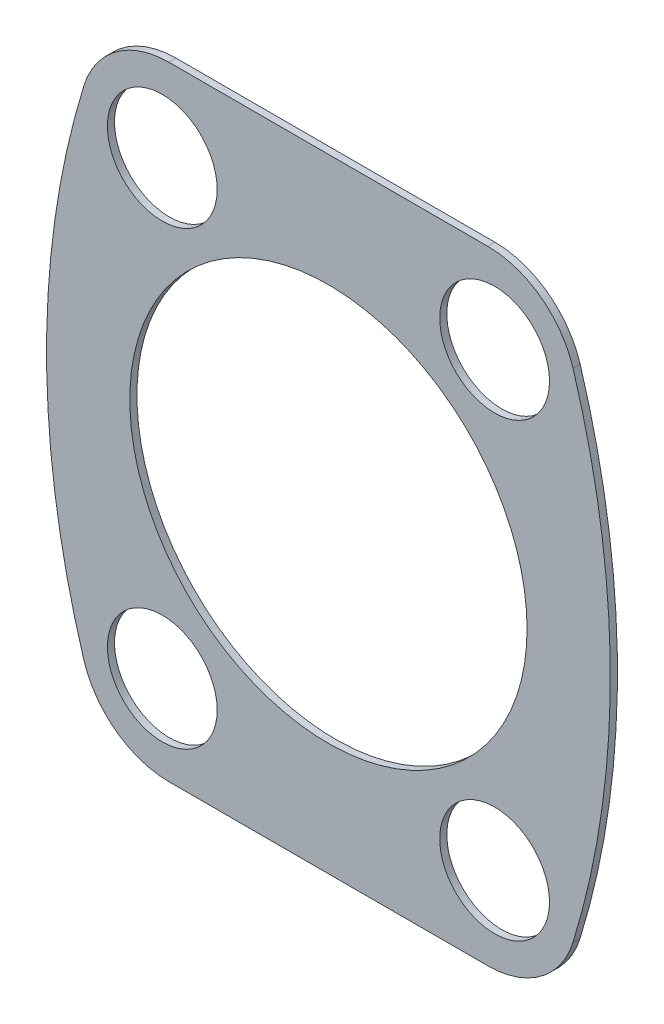
ISO-10303-21;
HEADER;
FILE_DESCRIPTION(('STEP AP214'),'2;1');
FILE_NAME('part.step','',(''),(''),'','','');
FILE_SCHEMA(('AUTOMOTIVE_DESIGN { 1 0 10303 214 1 1 1 1 }'));
ENDSEC;
DATA;
#1=APPLICATION_CONTEXT('core data for automotive mechanical design processes');
#2=APPLICATION_PROTOCOL_DEFINITION('international standard','automotive_design',2000,#1);
#3=PRODUCT_CONTEXT('',#1,'mechanical');
#4=PRODUCT('Part','Part','',(#3));
#5=PRODUCT_RELATED_PRODUCT_CATEGORY('part','',(#4));
#6=PRODUCT_DEFINITION_FORMATION('','',#4);
#7=PRODUCT_DEFINITION_CONTEXT('part definition',#1,'design');
#8=PRODUCT_DEFINITION('design','',#6,#7);
#9=PRODUCT_DEFINITION_SHAPE('','',#8);
#10=(LENGTH_UNIT() NAMED_UNIT(*) SI_UNIT(.MILLI.,.METRE.));
#11=(NAMED_UNIT(*) PLANE_ANGLE_UNIT() SI_UNIT($,.RADIAN.));
#12=(NAMED_UNIT(*) SI_UNIT($,.STERADIAN.) SOLID_ANGLE_UNIT());
#13=UNCERTAINTY_MEASURE_WITH_UNIT(LENGTH_MEASURE(1.E-05),#10,'distance_accuracy_value','');
#14=(GEOMETRIC_REPRESENTATION_CONTEXT(3) GLOBAL_UNCERTAINTY_ASSIGNED_CONTEXT((#13)) GLOBAL_UNIT_ASSIGNED_CONTEXT((#10,
#11,#12)) REPRESENTATION_CONTEXT('',''));
#15=CARTESIAN_POINT('',(0.,0.,0.));
#16=DIRECTION('',(0.,0.,1.));
#17=DIRECTION('',(1.,0.,0.));
#18=AXIS2_PLACEMENT_3D('',#15,#16,#17);
#19=CARTESIAN_POINT('',(-26.875,37.5000000000001,1.19999999999998));
#20=DIRECTION('',(0.,0.,1.));
#21=DIRECTION('',(1.,0.,0.));
#22=AXIS2_PLACEMENT_3D('',#19,#20,#21);
#23=PLANE('',#22);
#24=CARTESIAN_POINT('',(-28.,38.,1.19999999999998));
#25=DIRECTION('',(0.,0.,1.));
#26=DIRECTION('',(1.,0.,0.));
#27=AXIS2_PLACEMENT_3D('',#24,#25,#26);
#28=CIRCLE('',#27,9.25);
#29=CARTESIAN_POINT('',(-18.75,38.,1.19999999999998));
#30=VERTEX_POINT('',#29);
#31=EDGE_CURVE('E204',#30,#30,#28,.T.);
#32=ORIENTED_EDGE('',*,*,#31,.F.);
#33=EDGE_LOOP('',(#32));
#34=FACE_BOUND('',#33,.T.);
#35=CARTESIAN_POINT('',(28.,-38.,1.19999999999998));
#36=DIRECTION('',(0.,0.,1.));
#37=DIRECTION('',(1.,0.,0.));
#38=AXIS2_PLACEMENT_3D('',#35,#36,#37);
#39=CIRCLE('',#38,9.25);
#40=CARTESIAN_POINT('',(37.25,-38.,1.19999999999998));
#41=VERTEX_POINT('',#40);
#42=EDGE_CURVE('E192',#41,#41,#39,.T.);
#43=ORIENTED_EDGE('',*,*,#42,.F.);
#44=EDGE_LOOP('',(#43));
#45=FACE_BOUND('',#44,.T.);
#46=CARTESIAN_POINT('',(-26.875,37.5000000000001,1.19999999999998));
#47=DIRECTION('',(0.,0.,1.));
#48=DIRECTION('',(1.,0.,0.));
#49=AXIS2_PLACEMENT_3D('',#46,#47,#48);
#50=CIRCLE('',#49,15.);
#51=CARTESIAN_POINT('',(-26.875,52.5,1.19999999999998));
#52=VERTEX_POINT('',#51);
#53=CARTESIAN_POINT('',(-41.2148533007335,41.9009779951101,1.19999999999998));
#54=VERTEX_POINT('',#53);
#55=EDGE_CURVE('E155',#52,#54,#50,.T.);
#56=ORIENTED_EDGE('',*,*,#55,.T.);
#57=CARTESIAN_POINT('',(95.3124999999993,0.,1.19999999999998));
#58=DIRECTION('',(0.,0.,1.));
#59=DIRECTION('',(1.,0.,0.));
#60=AXIS2_PLACEMENT_3D('',#57,#58,#59);
#61=CIRCLE('',#60,142.812499999999);
#62=CARTESIAN_POINT('',(-41.2148533007335,-41.9009779951098,1.19999999999998));
#63=VERTEX_POINT('',#62);
#64=EDGE_CURVE('E103',#54,#63,#61,.T.);
#65=ORIENTED_EDGE('',*,*,#64,.T.);
#66=CARTESIAN_POINT('',(-26.875,-37.5000000000001,1.19999999999998));
#67=DIRECTION('',(0.,0.,1.));
#68=DIRECTION('',(1.,0.,0.));
#69=AXIS2_PLACEMENT_3D('',#66,#67,#68);
#70=CIRCLE('',#69,15.);
#71=CARTESIAN_POINT('',(-26.875,-52.5,1.19999999999998));
#72=VERTEX_POINT('',#71);
#73=EDGE_CURVE('E170',#63,#72,#70,.T.);
#74=ORIENTED_EDGE('',*,*,#73,.T.);
#75=DIRECTION('',(1.,0.,0.));
#76=VECTOR('',#75,1.);
#77=CARTESIAN_POINT('',(-26.875,-52.5,1.19999999999998));
#78=LINE('',#77,#76);
#79=CARTESIAN_POINT('',(26.875,-52.5,1.19999999999998));
#80=VERTEX_POINT('',#79);
#81=EDGE_CURVE('E183',#72,#80,#78,.T.);
#82=ORIENTED_EDGE('',*,*,#81,.T.);
#83=CARTESIAN_POINT('',(26.875,-37.5000000000001,1.19999999999998));
#84=DIRECTION('',(0.,0.,1.));
#85=DIRECTION('',(1.,0.,0.));
#86=AXIS2_PLACEMENT_3D('',#83,#84,#85);
#87=CIRCLE('',#86,15.);
#88=CARTESIAN_POINT('',(41.2148533007335,-41.9009779951101,1.19999999999998));
#89=VERTEX_POINT('',#88);
#90=EDGE_CURVE('E122',#80,#89,#87,.T.);
#91=ORIENTED_EDGE('',*,*,#90,.T.);
#92=CARTESIAN_POINT('',(-95.3124999999993,0.,1.19999999999998));
#93=DIRECTION('',(0.,0.,1.));
#94=DIRECTION('',(1.,0.,0.));
#95=AXIS2_PLACEMENT_3D('',#92,#93,#94);
#96=CIRCLE('',#95,142.812499999999);
#97=CARTESIAN_POINT('',(41.2148533007335,41.9009779951101,1.19999999999998));
#98=VERTEX_POINT('',#97);
#99=EDGE_CURVE('E116',#89,#98,#96,.T.);
#100=ORIENTED_EDGE('',*,*,#99,.T.);
#101=CARTESIAN_POINT('',(26.875,37.5000000000001,1.19999999999998));
#102=DIRECTION('',(0.,0.,1.));
#103=DIRECTION('',(1.,0.,0.));
#104=AXIS2_PLACEMENT_3D('',#101,#102,#103);
#105=CIRCLE('',#104,15.);
#106=CARTESIAN_POINT('',(26.875,52.5,1.19999999999998));
#107=VERTEX_POINT('',#106);
#108=EDGE_CURVE('E120',#98,#107,#105,.T.);
#109=ORIENTED_EDGE('',*,*,#108,.T.);
#110=DIRECTION('',(-1.,0.,0.));
#111=VECTOR('',#110,1.);
#112=CARTESIAN_POINT('',(26.875,52.5,1.19999999999998));
#113=LINE('',#112,#111);
#114=EDGE_CURVE('E60',#107,#52,#113,.T.);
#115=ORIENTED_EDGE('',*,*,#114,.T.);
#116=EDGE_LOOP('',(#56,#65,#74,#82,#91,#100,#109,#115));
#117=FACE_BOUND('',#116,.T.);
#118=CARTESIAN_POINT('',(-28.,-38.,1.19999999999998));
#119=DIRECTION('',(0.,0.,1.));
#120=DIRECTION('',(1.,0.,0.));
#121=AXIS2_PLACEMENT_3D('',#118,#119,#120);
#122=CIRCLE('',#121,9.25);
#123=CARTESIAN_POINT('',(-18.75,-38.,1.19999999999998));
#124=VERTEX_POINT('',#123);
#125=EDGE_CURVE('E144',#124,#124,#122,.T.);
#126=ORIENTED_EDGE('',*,*,#125,.F.);
#127=EDGE_LOOP('',(#126));
#128=FACE_BOUND('',#127,.T.);
#129=CARTESIAN_POINT('',(28.,38.,1.19999999999998));
#130=DIRECTION('',(0.,0.,1.));
#131=DIRECTION('',(1.,0.,0.));
#132=AXIS2_PLACEMENT_3D('',#129,#130,#131);
#133=CIRCLE('',#132,9.25);
#134=CARTESIAN_POINT('',(37.25,38.,1.19999999999998));
#135=VERTEX_POINT('',#134);
#136=EDGE_CURVE('E198',#135,#135,#133,.T.);
#137=ORIENTED_EDGE('',*,*,#136,.F.);
#138=EDGE_LOOP('',(#137));
#139=FACE_BOUND('',#138,.T.);
#140=CARTESIAN_POINT('',(0.,0.,1.19999999999998));
#141=DIRECTION('',(0.,0.,1.));
#142=DIRECTION('',(1.,0.,0.));
#143=AXIS2_PLACEMENT_3D('',#140,#141,#142);
#144=CIRCLE('',#143,33.475);
#145=CARTESIAN_POINT('',(33.475,0.,1.19999999999998));
#146=VERTEX_POINT('',#145);
#147=EDGE_CURVE('E210',#146,#146,#144,.T.);
#148=ORIENTED_EDGE('',*,*,#147,.F.);
#149=EDGE_LOOP('',(#148));
#150=FACE_BOUND('',#149,.T.);
#151=ADVANCED_FACE('F43',(#34,#45,#117,#128,#139,#150),#23,.T.);
#152=CARTESIAN_POINT('',(-26.875,37.5000000000001,0.));
#153=DIRECTION('',(0.,0.,1.));
#154=DIRECTION('',(1.,0.,0.));
#155=AXIS2_PLACEMENT_3D('',#152,#153,#154);
#156=PLANE('',#155);
#157=CARTESIAN_POINT('',(-28.,38.,0.));
#158=DIRECTION('',(0.,0.,1.));
#159=DIRECTION('',(1.,0.,0.));
#160=AXIS2_PLACEMENT_3D('',#157,#158,#159);
#161=CIRCLE('',#160,9.25);
#162=CARTESIAN_POINT('',(-18.75,38.,0.));
#163=VERTEX_POINT('',#162);
#164=EDGE_CURVE('E207',#163,#163,#161,.T.);
#165=ORIENTED_EDGE('',*,*,#164,.T.);
#166=EDGE_LOOP('',(#165));
#167=FACE_BOUND('',#166,.T.);
#168=CARTESIAN_POINT('',(28.,-38.,0.));
#169=DIRECTION('',(0.,0.,1.));
#170=DIRECTION('',(1.,0.,0.));
#171=AXIS2_PLACEMENT_3D('',#168,#169,#170);
#172=CIRCLE('',#171,9.25);
#173=CARTESIAN_POINT('',(37.25,-38.,0.));
#174=VERTEX_POINT('',#173);
#175=EDGE_CURVE('E195',#174,#174,#172,.T.);
#176=ORIENTED_EDGE('',*,*,#175,.T.);
#177=EDGE_LOOP('',(#176));
#178=FACE_BOUND('',#177,.T.);
#179=CARTESIAN_POINT('',(-26.875,37.5000000000001,0.));
#180=DIRECTION('',(0.,0.,1.));
#181=DIRECTION('',(1.,0.,0.));
#182=AXIS2_PLACEMENT_3D('',#179,#180,#181);
#183=CIRCLE('',#182,15.);
#184=CARTESIAN_POINT('',(-26.875,52.5,0.));
#185=VERTEX_POINT('',#184);
#186=CARTESIAN_POINT('',(-41.2148533007335,41.9009779951101,0.));
#187=VERTEX_POINT('',#186);
#188=EDGE_CURVE('E140',#185,#187,#183,.T.);
#189=ORIENTED_EDGE('',*,*,#188,.F.);
#190=DIRECTION('',(-1.,0.,0.));
#191=VECTOR('',#190,1.);
#192=CARTESIAN_POINT('',(26.875,52.5,0.));
#193=LINE('',#192,#191);
#194=CARTESIAN_POINT('',(26.875,52.5,0.));
#195=VERTEX_POINT('',#194);
#196=EDGE_CURVE('E95',#195,#185,#193,.T.);
#197=ORIENTED_EDGE('',*,*,#196,.F.);
#198=CARTESIAN_POINT('',(26.875,37.5000000000001,0.));
#199=DIRECTION('',(0.,0.,1.));
#200=DIRECTION('',(1.,0.,0.));
#201=AXIS2_PLACEMENT_3D('',#198,#199,#200);
#202=CIRCLE('',#201,15.);
#203=CARTESIAN_POINT('',(41.2148533007335,41.9009779951101,0.));
#204=VERTEX_POINT('',#203);
#205=EDGE_CURVE('E89',#204,#195,#202,.T.);
#206=ORIENTED_EDGE('',*,*,#205,.F.);
#207=CARTESIAN_POINT('',(-95.3124999999993,0.,0.));
#208=DIRECTION('',(0.,0.,1.));
#209=DIRECTION('',(1.,0.,0.));
#210=AXIS2_PLACEMENT_3D('',#207,#208,#209);
#211=CIRCLE('',#210,142.812499999999);
#212=CARTESIAN_POINT('',(41.2148533007335,-41.9009779951101,0.));
#213=VERTEX_POINT('',#212);
#214=EDGE_CURVE('E130',#213,#204,#211,.T.);
#215=ORIENTED_EDGE('',*,*,#214,.F.);
#216=CARTESIAN_POINT('',(26.875,-37.5000000000001,0.));
#217=DIRECTION('',(0.,0.,1.));
#218=DIRECTION('',(1.,0.,0.));
#219=AXIS2_PLACEMENT_3D('',#216,#217,#218);
#220=CIRCLE('',#219,15.);
#221=CARTESIAN_POINT('',(26.875,-52.5,0.));
#222=VERTEX_POINT('',#221);
#223=EDGE_CURVE('E150',#222,#213,#220,.T.);
#224=ORIENTED_EDGE('',*,*,#223,.F.);
#225=DIRECTION('',(1.,0.,0.));
#226=VECTOR('',#225,1.);
#227=CARTESIAN_POINT('',(-26.875,-52.5,0.));
#228=LINE('',#227,#226);
#229=CARTESIAN_POINT('',(-26.875,-52.5,0.));
#230=VERTEX_POINT('',#229);
#231=EDGE_CURVE('E148',#230,#222,#228,.T.);
#232=ORIENTED_EDGE('',*,*,#231,.F.);
#233=CARTESIAN_POINT('',(-26.875,-37.5000000000001,0.));
#234=DIRECTION('',(0.,0.,1.));
#235=DIRECTION('',(1.,0.,0.));
#236=AXIS2_PLACEMENT_3D('',#233,#234,#235);
#237=CIRCLE('',#236,15.);
#238=CARTESIAN_POINT('',(-41.2148533007335,-41.9009779951098,0.));
#239=VERTEX_POINT('',#238);
#240=EDGE_CURVE('E146',#239,#230,#237,.T.);
#241=ORIENTED_EDGE('',*,*,#240,.F.);
#242=CARTESIAN_POINT('',(95.3124999999993,0.,0.));
#243=DIRECTION('',(0.,0.,1.));
#244=DIRECTION('',(1.,0.,0.));
#245=AXIS2_PLACEMENT_3D('',#242,#243,#244);
#246=CIRCLE('',#245,142.812499999999);
#247=EDGE_CURVE('E143',#187,#239,#246,.T.);
#248=ORIENTED_EDGE('',*,*,#247,.F.);
#249=EDGE_LOOP('',(#189,#197,#206,#215,#224,#232,#241,#248));
#250=FACE_BOUND('',#249,.T.);
#251=CARTESIAN_POINT('',(-28.,-38.,0.));
#252=DIRECTION('',(0.,0.,1.));
#253=DIRECTION('',(1.,0.,0.));
#254=AXIS2_PLACEMENT_3D('',#251,#252,#253);
#255=CIRCLE('',#254,9.25);
#256=CARTESIAN_POINT('',(-18.75,-38.,0.));
#257=VERTEX_POINT('',#256);
#258=EDGE_CURVE('E189',#257,#257,#255,.T.);
#259=ORIENTED_EDGE('',*,*,#258,.T.);
#260=EDGE_LOOP('',(#259));
#261=FACE_BOUND('',#260,.T.);
#262=CARTESIAN_POINT('',(28.,38.,0.));
#263=DIRECTION('',(0.,0.,1.));
#264=DIRECTION('',(1.,0.,0.));
#265=AXIS2_PLACEMENT_3D('',#262,#263,#264);
#266=CIRCLE('',#265,9.25);
#267=CARTESIAN_POINT('',(37.25,38.,0.));
#268=VERTEX_POINT('',#267);
#269=EDGE_CURVE('E201',#268,#268,#266,.T.);
#270=ORIENTED_EDGE('',*,*,#269,.T.);
#271=EDGE_LOOP('',(#270));
#272=FACE_BOUND('',#271,.T.);
#273=CARTESIAN_POINT('',(0.,0.,0.));
#274=DIRECTION('',(0.,0.,1.));
#275=DIRECTION('',(1.,0.,0.));
#276=AXIS2_PLACEMENT_3D('',#273,#274,#275);
#277=CIRCLE('',#276,33.475);
#278=CARTESIAN_POINT('',(33.475,0.,0.));
#279=VERTEX_POINT('',#278);
#280=EDGE_CURVE('E213',#279,#279,#277,.T.);
#281=ORIENTED_EDGE('',*,*,#280,.T.);
#282=EDGE_LOOP('',(#281));
#283=FACE_BOUND('',#282,.T.);
#284=ADVANCED_FACE('F174',(#167,#178,#250,#261,#272,#283),#156,.F.);
#285=CARTESIAN_POINT('',(-26.875,37.5000000000001,1.19999999999998));
#286=DIRECTION('',(0.,0.,-1.));
#287=DIRECTION('',(-1.,0.,0.));
#288=AXIS2_PLACEMENT_3D('',#285,#286,#287);
#289=CYLINDRICAL_SURFACE('',#288,15.);
#290=ORIENTED_EDGE('',*,*,#188,.T.);
#291=DIRECTION('',(0.,0.,-1.));
#292=VECTOR('',#291,1.);
#293=CARTESIAN_POINT('',(-41.2148533007335,41.9009779951101,1.19999999999998));
#294=LINE('',#293,#292);
#295=EDGE_CURVE('E11',#54,#187,#294,.T.);
#296=ORIENTED_EDGE('',*,*,#295,.F.);
#297=ORIENTED_EDGE('',*,*,#55,.F.);
#298=DIRECTION('',(0.,0.,-1.));
#299=VECTOR('',#298,1.);
#300=CARTESIAN_POINT('',(-26.875,52.5,1.19999999999998));
#301=LINE('',#300,#299);
#302=EDGE_CURVE('E136',#52,#185,#301,.T.);
#303=ORIENTED_EDGE('',*,*,#302,.T.);
#304=EDGE_LOOP('',(#290,#296,#297,#303));
#305=FACE_BOUND('',#304,.T.);
#306=ADVANCED_FACE('F45',(#305),#289,.T.);
#307=CARTESIAN_POINT('',(95.3124999999993,0.,1.19999999999998));
#308=DIRECTION('',(0.,0.,-1.));
#309=DIRECTION('',(-1.,0.,0.));
#310=AXIS2_PLACEMENT_3D('',#307,#308,#309);
#311=CYLINDRICAL_SURFACE('',#310,142.812499999999);
#312=ORIENTED_EDGE('',*,*,#247,.T.);
#313=DIRECTION('',(0.,0.,-1.));
#314=VECTOR('',#313,1.);
#315=CARTESIAN_POINT('',(-41.2148533007335,-41.9009779951098,1.19999999999998));
#316=LINE('',#315,#314);
#317=EDGE_CURVE('E52',#63,#239,#316,.T.);
#318=ORIENTED_EDGE('',*,*,#317,.F.);
#319=ORIENTED_EDGE('',*,*,#64,.F.);
#320=ORIENTED_EDGE('',*,*,#295,.T.);
#321=EDGE_LOOP('',(#312,#318,#319,#320));
#322=FACE_BOUND('',#321,.T.);
#323=ADVANCED_FACE('F248',(#322),#311,.T.);
#324=CARTESIAN_POINT('',(-26.875,-37.5000000000001,1.19999999999998));
#325=DIRECTION('',(0.,0.,-1.));
#326=DIRECTION('',(-1.,0.,0.));
#327=AXIS2_PLACEMENT_3D('',#324,#325,#326);
#328=CYLINDRICAL_SURFACE('',#327,15.);
#329=ORIENTED_EDGE('',*,*,#240,.T.);
#330=DIRECTION('',(0.,0.,-1.));
#331=VECTOR('',#330,1.);
#332=CARTESIAN_POINT('',(-26.875,-52.5,1.19999999999998));
#333=LINE('',#332,#331);
#334=EDGE_CURVE('E162',#72,#230,#333,.T.);
#335=ORIENTED_EDGE('',*,*,#334,.F.);
#336=ORIENTED_EDGE('',*,*,#73,.F.);
#337=ORIENTED_EDGE('',*,*,#317,.T.);
#338=EDGE_LOOP('',(#329,#335,#336,#337));
#339=FACE_BOUND('',#338,.T.);
#340=ADVANCED_FACE('F168',(#339),#328,.T.);
#341=CARTESIAN_POINT('',(-26.875,-52.5,1.19999999999998));
#342=DIRECTION('',(0.,1.,0.));
#343=DIRECTION('',(-1.,0.,0.));
#344=AXIS2_PLACEMENT_3D('',#341,#342,#343);
#345=PLANE('',#344);
#346=ORIENTED_EDGE('',*,*,#231,.T.);
#347=DIRECTION('',(0.,0.,-1.));
#348=VECTOR('',#347,1.);
#349=CARTESIAN_POINT('',(26.875,-52.5,1.19999999999998));
#350=LINE('',#349,#348);
#351=EDGE_CURVE('E159',#80,#222,#350,.T.);
#352=ORIENTED_EDGE('',*,*,#351,.F.);
#353=ORIENTED_EDGE('',*,*,#81,.F.);
#354=ORIENTED_EDGE('',*,*,#334,.T.);
#355=EDGE_LOOP('',(#346,#352,#353,#354));
#356=FACE_BOUND('',#355,.T.);
#357=ADVANCED_FACE('F179',(#356),#345,.F.);
#358=CARTESIAN_POINT('',(26.875,-37.5000000000001,1.19999999999998));
#359=DIRECTION('',(0.,0.,-1.));
#360=DIRECTION('',(-1.,0.,0.));
#361=AXIS2_PLACEMENT_3D('',#358,#359,#360);
#362=CYLINDRICAL_SURFACE('',#361,15.);
#363=ORIENTED_EDGE('',*,*,#223,.T.);
#364=DIRECTION('',(0.,0.,-1.));
#365=VECTOR('',#364,1.);
#366=CARTESIAN_POINT('',(41.2148533007335,-41.9009779951101,1.19999999999998));
#367=LINE('',#366,#365);
#368=EDGE_CURVE('E131',#89,#213,#367,.T.);
#369=ORIENTED_EDGE('',*,*,#368,.F.);
#370=ORIENTED_EDGE('',*,*,#90,.F.);
#371=ORIENTED_EDGE('',*,*,#351,.T.);
#372=EDGE_LOOP('',(#363,#369,#370,#371));
#373=FACE_BOUND('',#372,.T.);
#374=ADVANCED_FACE('F182',(#373),#362,.T.);
#375=CARTESIAN_POINT('',(-95.3124999999993,0.,1.19999999999998));
#376=DIRECTION('',(0.,0.,-1.));
#377=DIRECTION('',(-1.,0.,0.));
#378=AXIS2_PLACEMENT_3D('',#375,#376,#377);
#379=CYLINDRICAL_SURFACE('',#378,142.812499999999);
#380=ORIENTED_EDGE('',*,*,#214,.T.);
#381=DIRECTION('',(0.,0.,-1.));
#382=VECTOR('',#381,1.);
#383=CARTESIAN_POINT('',(41.2148533007335,41.9009779951101,1.19999999999998));
#384=LINE('',#383,#382);
#385=EDGE_CURVE('E127',#98,#204,#384,.T.);
#386=ORIENTED_EDGE('',*,*,#385,.F.);
#387=ORIENTED_EDGE('',*,*,#99,.F.);
#388=ORIENTED_EDGE('',*,*,#368,.T.);
#389=EDGE_LOOP('',(#380,#386,#387,#388));
#390=FACE_BOUND('',#389,.T.);
#391=ADVANCED_FACE('F128',(#390),#379,.T.);
#392=CARTESIAN_POINT('',(26.875,37.5000000000001,1.19999999999998));
#393=DIRECTION('',(0.,0.,-1.));
#394=DIRECTION('',(-1.,0.,0.));
#395=AXIS2_PLACEMENT_3D('',#392,#393,#394);
#396=CYLINDRICAL_SURFACE('',#395,15.);
#397=ORIENTED_EDGE('',*,*,#205,.T.);
#398=DIRECTION('',(0.,0.,-1.));
#399=VECTOR('',#398,1.);
#400=CARTESIAN_POINT('',(26.875,52.5,1.19999999999998));
#401=LINE('',#400,#399);
#402=EDGE_CURVE('E132',#107,#195,#401,.T.);
#403=ORIENTED_EDGE('',*,*,#402,.F.);
#404=ORIENTED_EDGE('',*,*,#108,.F.);
#405=ORIENTED_EDGE('',*,*,#385,.T.);
#406=EDGE_LOOP('',(#397,#403,#404,#405));
#407=FACE_BOUND('',#406,.T.);
#408=ADVANCED_FACE('F134',(#407),#396,.T.);
#409=CARTESIAN_POINT('',(26.875,52.5,1.19999999999998));
#410=DIRECTION('',(0.,-1.,0.));
#411=DIRECTION('',(0.,0.,-1.));
#412=AXIS2_PLACEMENT_3D('',#409,#410,#411);
#413=PLANE('',#412);
#414=ORIENTED_EDGE('',*,*,#196,.T.);
#415=ORIENTED_EDGE('',*,*,#302,.F.);
#416=ORIENTED_EDGE('',*,*,#114,.F.);
#417=ORIENTED_EDGE('',*,*,#402,.T.);
#418=EDGE_LOOP('',(#414,#415,#416,#417));
#419=FACE_BOUND('',#418,.T.);
#420=ADVANCED_FACE('F236',(#419),#413,.F.);
#421=CARTESIAN_POINT('',(-28.,-38.,1.19999999999998));
#422=DIRECTION('',(0.,0.,-1.));
#423=DIRECTION('',(-1.,0.,0.));
#424=AXIS2_PLACEMENT_3D('',#421,#422,#423);
#425=CYLINDRICAL_SURFACE('',#424,9.25);
#426=ORIENTED_EDGE('',*,*,#125,.T.);
#427=EDGE_LOOP('',(#426));
#428=FACE_BOUND('',#427,.T.);
#429=ORIENTED_EDGE('',*,*,#258,.F.);
#430=EDGE_LOOP('',(#429));
#431=FACE_BOUND('',#430,.T.);
#432=ADVANCED_FACE('F233',(#428,#431),#425,.F.);
#433=CARTESIAN_POINT('',(28.,-38.,1.19999999999998));
#434=DIRECTION('',(0.,0.,-1.));
#435=DIRECTION('',(-1.,0.,0.));
#436=AXIS2_PLACEMENT_3D('',#433,#434,#435);
#437=CYLINDRICAL_SURFACE('',#436,9.25);
#438=ORIENTED_EDGE('',*,*,#42,.T.);
#439=EDGE_LOOP('',(#438));
#440=FACE_BOUND('',#439,.T.);
#441=ORIENTED_EDGE('',*,*,#175,.F.);
#442=EDGE_LOOP('',(#441));
#443=FACE_BOUND('',#442,.T.);
#444=ADVANCED_FACE('F297',(#440,#443),#437,.F.);
#445=CARTESIAN_POINT('',(28.,38.,1.19999999999998));
#446=DIRECTION('',(0.,0.,-1.));
#447=DIRECTION('',(-1.,0.,0.));
#448=AXIS2_PLACEMENT_3D('',#445,#446,#447);
#449=CYLINDRICAL_SURFACE('',#448,9.25);
#450=ORIENTED_EDGE('',*,*,#136,.T.);
#451=EDGE_LOOP('',(#450));
#452=FACE_BOUND('',#451,.T.);
#453=ORIENTED_EDGE('',*,*,#269,.F.);
#454=EDGE_LOOP('',(#453));
#455=FACE_BOUND('',#454,.T.);
#456=ADVANCED_FACE('F304',(#452,#455),#449,.F.);
#457=CARTESIAN_POINT('',(-28.,38.,1.19999999999998));
#458=DIRECTION('',(0.,0.,-1.));
#459=DIRECTION('',(-1.,0.,0.));
#460=AXIS2_PLACEMENT_3D('',#457,#458,#459);
#461=CYLINDRICAL_SURFACE('',#460,9.25);
#462=ORIENTED_EDGE('',*,*,#31,.T.);
#463=EDGE_LOOP('',(#462));
#464=FACE_BOUND('',#463,.T.);
#465=ORIENTED_EDGE('',*,*,#164,.F.);
#466=EDGE_LOOP('',(#465));
#467=FACE_BOUND('',#466,.T.);
#468=ADVANCED_FACE('F311',(#464,#467),#461,.F.);
#469=CARTESIAN_POINT('',(0.,0.,1.19999999999998));
#470=DIRECTION('',(0.,0.,-1.));
#471=DIRECTION('',(-1.,0.,0.));
#472=AXIS2_PLACEMENT_3D('',#469,#470,#471);
#473=CYLINDRICAL_SURFACE('',#472,33.475);
#474=ORIENTED_EDGE('',*,*,#147,.T.);
#475=EDGE_LOOP('',(#474));
#476=FACE_BOUND('',#475,.T.);
#477=ORIENTED_EDGE('',*,*,#280,.F.);
#478=EDGE_LOOP('',(#477));
#479=FACE_BOUND('',#478,.T.);
#480=ADVANCED_FACE('F219',(#476,#479),#473,.F.);
#481=CLOSED_SHELL('',(#151,#284,#306,#323,#340,#357,#374,#391,#408,#420,#432,#444,#456,#468,#480));
#482=MANIFOLD_SOLID_BREP('B2',#481);
#483=ADVANCED_BREP_SHAPE_REPRESENTATION('',(#18,#482),#14);
#484=SHAPE_DEFINITION_REPRESENTATION(#9,#483);
ENDSEC;
END-ISO-10303-21;
